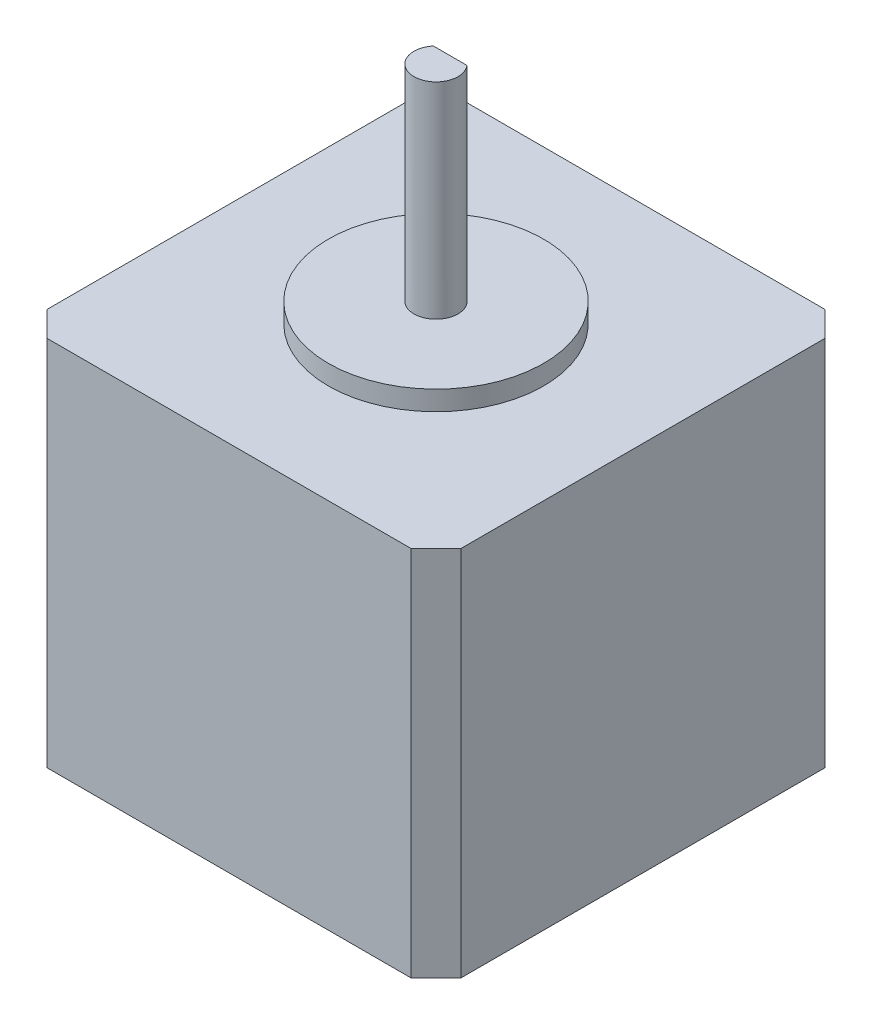
ISO-10303-21;
HEADER;
FILE_DESCRIPTION(('STEP AP214'),'2;1');
FILE_NAME('part.step','',(''),(''),'','','');
FILE_SCHEMA(('AUTOMOTIVE_DESIGN { 1 0 10303 214 1 1 1 1 }'));
ENDSEC;
DATA;
#1=APPLICATION_CONTEXT('core data for automotive mechanical design processes');
#2=APPLICATION_PROTOCOL_DEFINITION('international standard','automotive_design',2000,#1);
#3=PRODUCT_CONTEXT('',#1,'mechanical');
#4=PRODUCT('Part','Part','',(#3));
#5=PRODUCT_RELATED_PRODUCT_CATEGORY('part','',(#4));
#6=PRODUCT_DEFINITION_FORMATION('','',#4);
#7=PRODUCT_DEFINITION_CONTEXT('part definition',#1,'design');
#8=PRODUCT_DEFINITION('design','',#6,#7);
#9=PRODUCT_DEFINITION_SHAPE('','',#8);
#10=(LENGTH_UNIT() NAMED_UNIT(*) SI_UNIT(.MILLI.,.METRE.));
#11=(NAMED_UNIT(*) PLANE_ANGLE_UNIT() SI_UNIT($,.RADIAN.));
#12=(NAMED_UNIT(*) SI_UNIT($,.STERADIAN.) SOLID_ANGLE_UNIT());
#13=UNCERTAINTY_MEASURE_WITH_UNIT(LENGTH_MEASURE(1.E-05),#10,'distance_accuracy_value','');
#14=(GEOMETRIC_REPRESENTATION_CONTEXT(3) GLOBAL_UNCERTAINTY_ASSIGNED_CONTEXT((#13)) GLOBAL_UNIT_ASSIGNED_CONTEXT((#10,
#11,#12)) REPRESENTATION_CONTEXT('',''));
#15=CARTESIAN_POINT('',(0.,0.,0.));
#16=DIRECTION('',(0.,0.,1.));
#17=DIRECTION('',(1.,0.,0.));
#18=AXIS2_PLACEMENT_3D('',#15,#16,#17);
#19=CARTESIAN_POINT('',(21.1499999909999,38.,21.1500000000001));
#20=DIRECTION('',(-1.,0.,0.));
#21=DIRECTION('',(0.,0.,1.));
#22=AXIS2_PLACEMENT_3D('',#19,#20,#21);
#23=PLANE('',#22);
#24=DIRECTION('',(0.,0.,-1.));
#25=VECTOR('',#24,1.);
#26=CARTESIAN_POINT('',(21.1499999909999,0.,21.1500000000001));
#27=LINE('',#26,#25);
#28=CARTESIAN_POINT('',(21.1499999909999,0.,18.6100000000001));
#29=VERTEX_POINT('',#28);
#30=CARTESIAN_POINT('',(21.1499999909999,0.,-18.6099999999999));
#31=VERTEX_POINT('',#30);
#32=EDGE_CURVE('E139',#29,#31,#27,.T.);
#33=ORIENTED_EDGE('',*,*,#32,.T.);
#34=DIRECTION('',(0.,1.,0.));
#35=VECTOR('',#34,1.);
#36=CARTESIAN_POINT('',(21.1499999909999,38.,-18.6099999999999));
#37=LINE('',#36,#35);
#38=CARTESIAN_POINT('',(21.1499999909999,38.,-18.6099999999999));
#39=VERTEX_POINT('',#38);
#40=EDGE_CURVE('E192',#31,#39,#37,.T.);
#41=ORIENTED_EDGE('',*,*,#40,.T.);
#42=DIRECTION('',(0.,0.,-1.));
#43=VECTOR('',#42,1.);
#44=CARTESIAN_POINT('',(21.1499999909999,38.,21.1500000000001));
#45=LINE('',#44,#43);
#46=CARTESIAN_POINT('',(21.1499999909999,38.,18.6100000000001));
#47=VERTEX_POINT('',#46);
#48=EDGE_CURVE('E142',#47,#39,#45,.T.);
#49=ORIENTED_EDGE('',*,*,#48,.F.);
#50=DIRECTION('',(0.,-1.,0.));
#51=VECTOR('',#50,1.);
#52=CARTESIAN_POINT('',(21.1499999909999,38.,18.6100000000001));
#53=LINE('',#52,#51);
#54=EDGE_CURVE('E189',#47,#29,#53,.T.);
#55=ORIENTED_EDGE('',*,*,#54,.T.);
#56=EDGE_LOOP('',(#33,#41,#49,#55));
#57=FACE_BOUND('',#56,.T.);
#58=ADVANCED_FACE('F36',(#57),#23,.F.);
#59=CARTESIAN_POINT('',(-21.1499999910001,38.,-21.1499999999999));
#60=DIRECTION('',(0.,0.,1.));
#61=DIRECTION('',(1.,0.,0.));
#62=AXIS2_PLACEMENT_3D('',#59,#60,#61);
#63=PLANE('',#62);
#64=DIRECTION('',(-1.,0.,0.));
#65=VECTOR('',#64,1.);
#66=CARTESIAN_POINT('',(-21.1499999910001,0.,-21.1499999999999));
#67=LINE('',#66,#65);
#68=CARTESIAN_POINT('',(18.6099999909999,0.,-21.1499999999999));
#69=VERTEX_POINT('',#68);
#70=CARTESIAN_POINT('',(-18.6099999910001,0.,-21.1499999999999));
#71=VERTEX_POINT('',#70);
#72=EDGE_CURVE('E157',#69,#71,#67,.T.);
#73=ORIENTED_EDGE('',*,*,#72,.T.);
#74=DIRECTION('',(0.,1.,0.));
#75=VECTOR('',#74,1.);
#76=CARTESIAN_POINT('',(-18.6099999910001,38.,-21.1499999999999));
#77=LINE('',#76,#75);
#78=CARTESIAN_POINT('',(-18.6099999910001,38.,-21.1499999999999));
#79=VERTEX_POINT('',#78);
#80=EDGE_CURVE('E179',#71,#79,#77,.T.);
#81=ORIENTED_EDGE('',*,*,#80,.T.);
#82=DIRECTION('',(-1.,0.,0.));
#83=VECTOR('',#82,1.);
#84=CARTESIAN_POINT('',(-21.1499999910001,38.,-21.1499999999999));
#85=LINE('',#84,#83);
#86=CARTESIAN_POINT('',(18.6099999909999,38.,-21.1499999999999));
#87=VERTEX_POINT('',#86);
#88=EDGE_CURVE('E145',#87,#79,#85,.T.);
#89=ORIENTED_EDGE('',*,*,#88,.F.);
#90=DIRECTION('',(0.,-1.,0.));
#91=VECTOR('',#90,1.);
#92=CARTESIAN_POINT('',(18.6099999909999,38.,-21.1499999999999));
#93=LINE('',#92,#91);
#94=EDGE_CURVE('E176',#87,#69,#93,.T.);
#95=ORIENTED_EDGE('',*,*,#94,.T.);
#96=EDGE_LOOP('',(#73,#81,#89,#95));
#97=FACE_BOUND('',#96,.T.);
#98=ADVANCED_FACE('F221',(#97),#63,.F.);
#99=CARTESIAN_POINT('',(-21.1499999910001,38.,21.1500000000001));
#100=DIRECTION('',(1.,0.,0.));
#101=DIRECTION('',(0.,0.,-1.));
#102=AXIS2_PLACEMENT_3D('',#99,#100,#101);
#103=PLANE('',#102);
#104=DIRECTION('',(0.,0.,1.));
#105=VECTOR('',#104,1.);
#106=CARTESIAN_POINT('',(-21.1499999910001,38.,21.1500000000001));
#107=LINE('',#106,#105);
#108=CARTESIAN_POINT('',(-21.1499999910001,38.,-18.6099999999999));
#109=VERTEX_POINT('',#108);
#110=CARTESIAN_POINT('',(-21.1499999910001,38.,18.6100000000001));
#111=VERTEX_POINT('',#110);
#112=EDGE_CURVE('E149',#109,#111,#107,.T.);
#113=ORIENTED_EDGE('',*,*,#112,.F.);
#114=DIRECTION('',(0.,-1.,0.));
#115=VECTOR('',#114,1.);
#116=CARTESIAN_POINT('',(-21.1499999910001,38.,-18.6099999999999));
#117=LINE('',#116,#115);
#118=CARTESIAN_POINT('',(-21.1499999910001,0.,-18.6099999999999));
#119=VERTEX_POINT('',#118);
#120=EDGE_CURVE('E165',#109,#119,#117,.T.);
#121=ORIENTED_EDGE('',*,*,#120,.T.);
#122=DIRECTION('',(0.,0.,1.));
#123=VECTOR('',#122,1.);
#124=CARTESIAN_POINT('',(-21.1499999910001,0.,21.1500000000001));
#125=LINE('',#124,#123);
#126=CARTESIAN_POINT('',(-21.1499999910001,0.,18.6100000000001));
#127=VERTEX_POINT('',#126);
#128=EDGE_CURVE('E160',#119,#127,#125,.T.);
#129=ORIENTED_EDGE('',*,*,#128,.T.);
#130=DIRECTION('',(0.,1.,0.));
#131=VECTOR('',#130,1.);
#132=CARTESIAN_POINT('',(-21.1499999910001,38.,18.6100000000001));
#133=LINE('',#132,#131);
#134=EDGE_CURVE('E154',#127,#111,#133,.T.);
#135=ORIENTED_EDGE('',*,*,#134,.T.);
#136=EDGE_LOOP('',(#113,#121,#129,#135));
#137=FACE_BOUND('',#136,.T.);
#138=ADVANCED_FACE('F229',(#137),#103,.F.);
#139=CARTESIAN_POINT('',(-21.1499999910001,38.,21.1500000000001));
#140=DIRECTION('',(0.,0.,-1.));
#141=DIRECTION('',(-1.,0.,0.));
#142=AXIS2_PLACEMENT_3D('',#139,#140,#141);
#143=PLANE('',#142);
#144=DIRECTION('',(1.,0.,0.));
#145=VECTOR('',#144,1.);
#146=CARTESIAN_POINT('',(-21.1499999910001,0.,21.1500000000001));
#147=LINE('',#146,#145);
#148=CARTESIAN_POINT('',(-18.6099999910001,0.,21.1500000000001));
#149=VERTEX_POINT('',#148);
#150=CARTESIAN_POINT('',(18.6099999909999,0.,21.1500000000001));
#151=VERTEX_POINT('',#150);
#152=EDGE_CURVE('E146',#149,#151,#147,.T.);
#153=ORIENTED_EDGE('',*,*,#152,.T.);
#154=DIRECTION('',(0.,1.,0.));
#155=VECTOR('',#154,1.);
#156=CARTESIAN_POINT('',(18.6099999909999,38.,21.1500000000001));
#157=LINE('',#156,#155);
#158=CARTESIAN_POINT('',(18.6099999909999,38.,21.1500000000001));
#159=VERTEX_POINT('',#158);
#160=EDGE_CURVE('E59',#151,#159,#157,.T.);
#161=ORIENTED_EDGE('',*,*,#160,.T.);
#162=DIRECTION('',(1.,0.,0.));
#163=VECTOR('',#162,1.);
#164=CARTESIAN_POINT('',(-21.1499999910001,38.,21.1500000000001));
#165=LINE('',#164,#163);
#166=CARTESIAN_POINT('',(-18.6099999910001,38.,21.1500000000001));
#167=VERTEX_POINT('',#166);
#168=EDGE_CURVE('E152',#167,#159,#165,.T.);
#169=ORIENTED_EDGE('',*,*,#168,.F.);
#170=DIRECTION('',(0.,-1.,0.));
#171=VECTOR('',#170,1.);
#172=CARTESIAN_POINT('',(-18.6099999910001,38.,21.1500000000001));
#173=LINE('',#172,#171);
#174=EDGE_CURVE('E194',#167,#149,#173,.T.);
#175=ORIENTED_EDGE('',*,*,#174,.T.);
#176=EDGE_LOOP('',(#153,#161,#169,#175));
#177=FACE_BOUND('',#176,.T.);
#178=ADVANCED_FACE('F198',(#177),#143,.F.);
#179=CARTESIAN_POINT('',(0.,38.,0.));
#180=DIRECTION('',(0.,-1.,0.));
#181=DIRECTION('',(0.,0.,-1.));
#182=AXIS2_PLACEMENT_3D('',#179,#180,#181);
#183=PLANE('',#182);
#184=CARTESIAN_POINT('',(0.,38.,0.));
#185=DIRECTION('',(0.,1.,0.));
#186=DIRECTION('',(0.,0.,1.));
#187=AXIS2_PLACEMENT_3D('',#184,#185,#186);
#188=CIRCLE('',#187,11.);
#189=CARTESIAN_POINT('',(0.,38.,11.));
#190=VERTEX_POINT('',#189);
#191=EDGE_CURVE('E136',#190,#190,#188,.T.);
#192=ORIENTED_EDGE('',*,*,#191,.F.);
#193=EDGE_LOOP('',(#192));
#194=FACE_BOUND('',#193,.T.);
#195=ORIENTED_EDGE('',*,*,#88,.T.);
#196=DIRECTION('',(0.707106781186549,0.,-0.707106781186546));
#197=VECTOR('',#196,1.);
#198=CARTESIAN_POINT('',(-21.1499999910001,38.,-18.6099999999999));
#199=LINE('',#198,#197);
#200=EDGE_CURVE('E187',#79,#109,#199,.F.);
#201=ORIENTED_EDGE('',*,*,#200,.T.);
#202=ORIENTED_EDGE('',*,*,#112,.T.);
#203=DIRECTION('',(-0.707106781186546,0.,-0.707106781186549));
#204=VECTOR('',#203,1.);
#205=CARTESIAN_POINT('',(-18.6099999910001,38.,21.1500000000001));
#206=LINE('',#205,#204);
#207=EDGE_CURVE('E181',#111,#167,#206,.F.);
#208=ORIENTED_EDGE('',*,*,#207,.T.);
#209=ORIENTED_EDGE('',*,*,#168,.T.);
#210=DIRECTION('',(-0.707106781186549,0.,0.707106781186546));
#211=VECTOR('',#210,1.);
#212=CARTESIAN_POINT('',(21.1499999909999,38.,18.6100000000001));
#213=LINE('',#212,#211);
#214=EDGE_CURVE('E183',#159,#47,#213,.F.);
#215=ORIENTED_EDGE('',*,*,#214,.T.);
#216=ORIENTED_EDGE('',*,*,#48,.T.);
#217=DIRECTION('',(0.707106781186546,0.,0.707106781186549));
#218=VECTOR('',#217,1.);
#219=CARTESIAN_POINT('',(18.6099999909999,38.,-21.1499999999999));
#220=LINE('',#219,#218);
#221=EDGE_CURVE('E185',#39,#87,#220,.F.);
#222=ORIENTED_EDGE('',*,*,#221,.T.);
#223=EDGE_LOOP('',(#195,#201,#202,#208,#209,#215,#216,#222));
#224=FACE_BOUND('',#223,.T.);
#225=ADVANCED_FACE('F214',(#194,#224),#183,.F.);
#226=CARTESIAN_POINT('',(0.,0.,0.));
#227=DIRECTION('',(0.,-1.,0.));
#228=DIRECTION('',(0.,0.,-1.));
#229=AXIS2_PLACEMENT_3D('',#226,#227,#228);
#230=PLANE('',#229);
#231=ORIENTED_EDGE('',*,*,#128,.F.);
#232=DIRECTION('',(-0.707106781186549,0.,0.707106781186546));
#233=VECTOR('',#232,1.);
#234=CARTESIAN_POINT('',(-19.8799999954999,0.,-19.8799999955));
#235=LINE('',#234,#233);
#236=EDGE_CURVE('E174',#119,#71,#235,.F.);
#237=ORIENTED_EDGE('',*,*,#236,.T.);
#238=ORIENTED_EDGE('',*,*,#72,.F.);
#239=DIRECTION('',(-0.707106781186546,0.,-0.707106781186549));
#240=VECTOR('',#239,1.);
#241=CARTESIAN_POINT('',(19.8799999955,0.,-19.8799999954998));
#242=LINE('',#241,#240);
#243=EDGE_CURVE('E172',#69,#31,#242,.F.);
#244=ORIENTED_EDGE('',*,*,#243,.T.);
#245=ORIENTED_EDGE('',*,*,#32,.F.);
#246=DIRECTION('',(0.707106781186549,0.,-0.707106781186546));
#247=VECTOR('',#246,1.);
#248=CARTESIAN_POINT('',(19.8799999955,0.,19.8799999955001));
#249=LINE('',#248,#247);
#250=EDGE_CURVE('E170',#29,#151,#249,.F.);
#251=ORIENTED_EDGE('',*,*,#250,.T.);
#252=ORIENTED_EDGE('',*,*,#152,.F.);
#253=DIRECTION('',(0.707106781186546,0.,0.707106781186549));
#254=VECTOR('',#253,1.);
#255=CARTESIAN_POINT('',(-19.8799999955002,0.,19.8799999955));
#256=LINE('',#255,#254);
#257=EDGE_CURVE('E168',#149,#127,#256,.F.);
#258=ORIENTED_EDGE('',*,*,#257,.T.);
#259=EDGE_LOOP('',(#231,#237,#238,#244,#245,#251,#252,#258));
#260=FACE_BOUND('',#259,.T.);
#261=ADVANCED_FACE('F203',(#260),#230,.T.);
#262=CARTESIAN_POINT('',(-21.1499999910001,38.,-18.6099999999999));
#263=DIRECTION('',(0.707106781186546,0.,0.707106781186549));
#264=DIRECTION('',(0.,-1.,0.));
#265=AXIS2_PLACEMENT_3D('',#262,#263,#264);
#266=PLANE('',#265);
#267=ORIENTED_EDGE('',*,*,#200,.F.);
#268=ORIENTED_EDGE('',*,*,#80,.F.);
#269=ORIENTED_EDGE('',*,*,#236,.F.);
#270=ORIENTED_EDGE('',*,*,#120,.F.);
#271=EDGE_LOOP('',(#267,#268,#269,#270));
#272=FACE_BOUND('',#271,.T.);
#273=ADVANCED_FACE('F226',(#272),#266,.F.);
#274=CARTESIAN_POINT('',(18.6099999909999,38.,-21.1499999999999));
#275=DIRECTION('',(-0.707106781186549,0.,0.707106781186546));
#276=DIRECTION('',(0.,-1.,0.));
#277=AXIS2_PLACEMENT_3D('',#274,#275,#276);
#278=PLANE('',#277);
#279=ORIENTED_EDGE('',*,*,#221,.F.);
#280=ORIENTED_EDGE('',*,*,#40,.F.);
#281=ORIENTED_EDGE('',*,*,#243,.F.);
#282=ORIENTED_EDGE('',*,*,#94,.F.);
#283=EDGE_LOOP('',(#279,#280,#281,#282));
#284=FACE_BOUND('',#283,.T.);
#285=ADVANCED_FACE('F218',(#284),#278,.F.);
#286=CARTESIAN_POINT('',(21.1499999909999,38.,18.6100000000001));
#287=DIRECTION('',(-0.707106781186546,0.,-0.707106781186549));
#288=DIRECTION('',(0.,-1.,0.));
#289=AXIS2_PLACEMENT_3D('',#286,#287,#288);
#290=PLANE('',#289);
#291=ORIENTED_EDGE('',*,*,#214,.F.);
#292=ORIENTED_EDGE('',*,*,#160,.F.);
#293=ORIENTED_EDGE('',*,*,#250,.F.);
#294=ORIENTED_EDGE('',*,*,#54,.F.);
#295=EDGE_LOOP('',(#291,#292,#293,#294));
#296=FACE_BOUND('',#295,.T.);
#297=ADVANCED_FACE('F208',(#296),#290,.F.);
#298=CARTESIAN_POINT('',(-18.6099999910001,38.,21.1500000000001));
#299=DIRECTION('',(0.707106781186549,0.,-0.707106781186546));
#300=DIRECTION('',(0.,-1.,0.));
#301=AXIS2_PLACEMENT_3D('',#298,#299,#300);
#302=PLANE('',#301);
#303=ORIENTED_EDGE('',*,*,#207,.F.);
#304=ORIENTED_EDGE('',*,*,#134,.F.);
#305=ORIENTED_EDGE('',*,*,#257,.F.);
#306=ORIENTED_EDGE('',*,*,#174,.F.);
#307=EDGE_LOOP('',(#303,#304,#305,#306));
#308=FACE_BOUND('',#307,.T.);
#309=ADVANCED_FACE('F38',(#308),#302,.F.);
#310=CARTESIAN_POINT('',(0.,40.,0.));
#311=DIRECTION('',(0.,-1.,0.));
#312=DIRECTION('',(0.,0.,-1.));
#313=AXIS2_PLACEMENT_3D('',#310,#311,#312);
#314=CYLINDRICAL_SURFACE('',#313,11.);
#315=CARTESIAN_POINT('',(0.,40.,0.));
#316=DIRECTION('',(0.,1.,0.));
#317=DIRECTION('',(0.,0.,1.));
#318=AXIS2_PLACEMENT_3D('',#315,#316,#317);
#319=CIRCLE('',#318,11.);
#320=CARTESIAN_POINT('',(0.,40.,11.));
#321=VERTEX_POINT('',#320);
#322=EDGE_CURVE('E133',#321,#321,#319,.T.);
#323=ORIENTED_EDGE('',*,*,#322,.F.);
#324=EDGE_LOOP('',(#323));
#325=FACE_BOUND('',#324,.T.);
#326=ORIENTED_EDGE('',*,*,#191,.T.);
#327=EDGE_LOOP('',(#326));
#328=FACE_BOUND('',#327,.T.);
#329=ADVANCED_FACE('F232',(#325,#328),#314,.T.);
#330=CARTESIAN_POINT('',(0.,40.,0.));
#331=DIRECTION('',(0.,1.,0.));
#332=DIRECTION('',(0.,0.,1.));
#333=AXIS2_PLACEMENT_3D('',#330,#331,#332);
#334=PLANE('',#333);
#335=CARTESIAN_POINT('',(0.,40.,0.));
#336=DIRECTION('',(0.,1.,0.));
#337=DIRECTION('',(0.,0.,1.));
#338=AXIS2_PLACEMENT_3D('',#335,#336,#337);
#339=CIRCLE('',#338,2.25);
#340=CARTESIAN_POINT('',(0.,40.,2.25));
#341=VERTEX_POINT('',#340);
#342=EDGE_CURVE('E44',#341,#341,#339,.T.);
#343=ORIENTED_EDGE('',*,*,#342,.F.);
#344=EDGE_LOOP('',(#343));
#345=FACE_BOUND('',#344,.T.);
#346=ORIENTED_EDGE('',*,*,#322,.T.);
#347=EDGE_LOOP('',(#346));
#348=FACE_BOUND('',#347,.T.);
#349=ADVANCED_FACE('F237',(#345,#348),#334,.T.);
#350=CARTESIAN_POINT('',(0.,61.,0.));
#351=DIRECTION('',(0.,-1.,0.));
#352=DIRECTION('',(0.,0.,-1.));
#353=AXIS2_PLACEMENT_3D('',#350,#351,#352);
#354=CYLINDRICAL_SURFACE('',#353,2.25);
#355=CARTESIAN_POINT('',(0.,43.,0.));
#356=DIRECTION('',(0.,1.,0.));
#357=DIRECTION('',(0.,0.,1.));
#358=AXIS2_PLACEMENT_3D('',#355,#356,#357);
#359=CIRCLE('',#358,2.25);
#360=CARTESIAN_POINT('',(1.71839485554299,43.,-1.45245279456628));
#361=VERTEX_POINT('',#360);
#362=CARTESIAN_POINT('',(-1.71839485554299,43.,-1.45245279456628));
#363=VERTEX_POINT('',#362);
#364=EDGE_CURVE('E11',#361,#363,#359,.T.);
#365=ORIENTED_EDGE('',*,*,#364,.F.);
#366=DIRECTION('',(0.,1.,0.));
#367=VECTOR('',#366,1.);
#368=CARTESIAN_POINT('',(1.71839485554299,43.,-1.45245279456628));
#369=LINE('',#368,#367);
#370=CARTESIAN_POINT('',(1.71839485554299,61.,-1.45245279456628));
#371=VERTEX_POINT('',#370);
#372=EDGE_CURVE('E120',#361,#371,#369,.T.);
#373=ORIENTED_EDGE('',*,*,#372,.T.);
#374=CARTESIAN_POINT('',(0.,61.,0.));
#375=DIRECTION('',(0.,1.,0.));
#376=DIRECTION('',(0.,0.,1.));
#377=AXIS2_PLACEMENT_3D('',#374,#375,#376);
#378=CIRCLE('',#377,2.25);
#379=CARTESIAN_POINT('',(-1.71839485554299,61.,-1.45245279456628));
#380=VERTEX_POINT('',#379);
#381=EDGE_CURVE('E127',#380,#371,#378,.T.);
#382=ORIENTED_EDGE('',*,*,#381,.F.);
#383=DIRECTION('',(0.,1.,0.));
#384=VECTOR('',#383,1.);
#385=CARTESIAN_POINT('',(-1.71839485554299,43.,-1.45245279456628));
#386=LINE('',#385,#384);
#387=EDGE_CURVE('E51',#363,#380,#386,.T.);
#388=ORIENTED_EDGE('',*,*,#387,.F.);
#389=EDGE_LOOP('',(#365,#373,#382,#388));
#390=FACE_BOUND('',#389,.T.);
#391=ORIENTED_EDGE('',*,*,#342,.T.);
#392=EDGE_LOOP('',(#391));
#393=FACE_BOUND('',#392,.T.);
#394=ADVANCED_FACE('F124',(#390,#393),#354,.T.);
#395=CARTESIAN_POINT('',(0.,61.,0.));
#396=DIRECTION('',(0.,1.,0.));
#397=DIRECTION('',(0.,0.,1.));
#398=AXIS2_PLACEMENT_3D('',#395,#396,#397);
#399=PLANE('',#398);
#400=DIRECTION('',(1.,0.,0.));
#401=VECTOR('',#400,1.);
#402=CARTESIAN_POINT('',(-1.71839485554299,61.,-1.45245279456628));
#403=LINE('',#402,#401);
#404=EDGE_CURVE('E121',#380,#371,#403,.T.);
#405=ORIENTED_EDGE('',*,*,#404,.F.);
#406=ORIENTED_EDGE('',*,*,#381,.T.);
#407=EDGE_LOOP('',(#405,#406));
#408=FACE_BOUND('',#407,.T.);
#409=ADVANCED_FACE('F300',(#408),#399,.T.);
#410=CARTESIAN_POINT('',(0.,43.,0.));
#411=DIRECTION('',(0.,1.,0.));
#412=DIRECTION('',(0.,0.,1.));
#413=AXIS2_PLACEMENT_3D('',#410,#411,#412);
#414=PLANE('',#413);
#415=ORIENTED_EDGE('',*,*,#364,.T.);
#416=DIRECTION('',(1.,0.,0.));
#417=VECTOR('',#416,1.);
#418=CARTESIAN_POINT('',(-1.71839485554299,43.,-1.45245279456628));
#419=LINE('',#418,#417);
#420=EDGE_CURVE('E116',#363,#361,#419,.T.);
#421=ORIENTED_EDGE('',*,*,#420,.T.);
#422=EDGE_LOOP('',(#415,#421));
#423=FACE_BOUND('',#422,.T.);
#424=ADVANCED_FACE('F115',(#423),#414,.T.);
#425=CARTESIAN_POINT('',(-1.71839485554299,43.,-1.45245279456628));
#426=DIRECTION('',(0.,0.,1.));
#427=DIRECTION('',(1.,0.,0.));
#428=AXIS2_PLACEMENT_3D('',#425,#426,#427);
#429=PLANE('',#428);
#430=ORIENTED_EDGE('',*,*,#404,.T.);
#431=ORIENTED_EDGE('',*,*,#372,.F.);
#432=ORIENTED_EDGE('',*,*,#420,.F.);
#433=ORIENTED_EDGE('',*,*,#387,.T.);
#434=EDGE_LOOP('',(#430,#431,#432,#433));
#435=FACE_BOUND('',#434,.T.);
#436=ADVANCED_FACE('F119',(#435),#429,.F.);
#437=CLOSED_SHELL('',(#58,#98,#138,#178,#225,#261,#273,#285,#297,#309,#329,#349,#394,#409,#424,#436));
#438=MANIFOLD_SOLID_BREP('B2',#437);
#439=ADVANCED_BREP_SHAPE_REPRESENTATION('',(#18,#438),#14);
#440=SHAPE_DEFINITION_REPRESENTATION(#9,#439);
ENDSEC;
END-ISO-10303-21;
